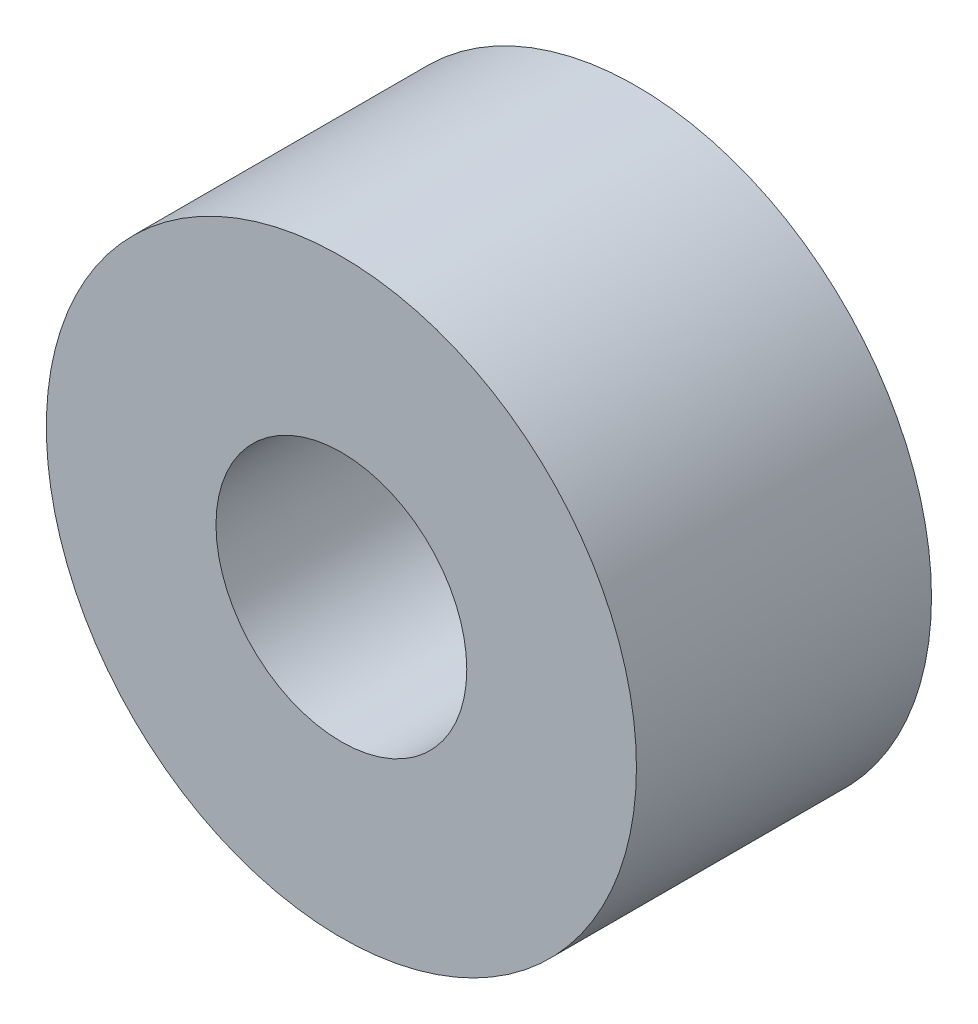
ISO-10303-21;
HEADER;
FILE_DESCRIPTION(('STEP AP214'),'2;1');
FILE_NAME('part.step','',(''),(''),'','','');
FILE_SCHEMA(('AUTOMOTIVE_DESIGN { 1 0 10303 214 1 1 1 1 }'));
ENDSEC;
DATA;
#1=APPLICATION_CONTEXT('core data for automotive mechanical design processes');
#2=APPLICATION_PROTOCOL_DEFINITION('international standard','automotive_design',2000,#1);
#3=PRODUCT_CONTEXT('',#1,'mechanical');
#4=PRODUCT('Part','Part','',(#3));
#5=PRODUCT_RELATED_PRODUCT_CATEGORY('part','',(#4));
#6=PRODUCT_DEFINITION_FORMATION('','',#4);
#7=PRODUCT_DEFINITION_CONTEXT('part definition',#1,'design');
#8=PRODUCT_DEFINITION('design','',#6,#7);
#9=PRODUCT_DEFINITION_SHAPE('','',#8);
#10=(LENGTH_UNIT() NAMED_UNIT(*) SI_UNIT(.MILLI.,.METRE.));
#11=(NAMED_UNIT(*) PLANE_ANGLE_UNIT() SI_UNIT($,.RADIAN.));
#12=(NAMED_UNIT(*) SI_UNIT($,.STERADIAN.) SOLID_ANGLE_UNIT());
#13=UNCERTAINTY_MEASURE_WITH_UNIT(LENGTH_MEASURE(1.E-05),#10,'distance_accuracy_value','');
#14=(GEOMETRIC_REPRESENTATION_CONTEXT(3) GLOBAL_UNCERTAINTY_ASSIGNED_CONTEXT((#13)) GLOBAL_UNIT_ASSIGNED_CONTEXT((#10,
#11,#12)) REPRESENTATION_CONTEXT('',''));
#15=CARTESIAN_POINT('',(0.,0.,0.));
#16=DIRECTION('',(0.,0.,1.));
#17=DIRECTION('',(1.,0.,0.));
#18=AXIS2_PLACEMENT_3D('',#15,#16,#17);
#19=CARTESIAN_POINT('',(-19.5000000000001,52.7999999999997,4.));
#20=DIRECTION('',(0.,0.,1.));
#21=DIRECTION('',(1.,0.,0.));
#22=AXIS2_PLACEMENT_3D('',#19,#20,#21);
#23=PLANE('',#22);
#24=CARTESIAN_POINT('',(-19.5000000000001,52.7999999999997,4.));
#25=DIRECTION('',(0.,0.,1.));
#26=DIRECTION('',(1.,0.,0.));
#27=AXIS2_PLACEMENT_3D('',#24,#25,#26);
#28=CIRCLE('',#27,4.);
#29=CARTESIAN_POINT('',(-15.5000000000001,52.7999999999997,4.));
#30=VERTEX_POINT('',#29);
#31=EDGE_CURVE('E10',#30,#30,#28,.T.);
#32=ORIENTED_EDGE('',*,*,#31,.T.);
#33=EDGE_LOOP('',(#32));
#34=FACE_BOUND('',#33,.T.);
#35=CARTESIAN_POINT('',(-19.5000000000001,52.7999999999997,4.));
#36=DIRECTION('',(0.,0.,1.));
#37=DIRECTION('',(1.,0.,0.));
#38=AXIS2_PLACEMENT_3D('',#35,#36,#37);
#39=CIRCLE('',#38,1.7);
#40=CARTESIAN_POINT('',(-17.8000000000001,52.7999999999997,4.));
#41=VERTEX_POINT('',#40);
#42=EDGE_CURVE('E43',#41,#41,#39,.T.);
#43=ORIENTED_EDGE('',*,*,#42,.F.);
#44=EDGE_LOOP('',(#43));
#45=FACE_BOUND('',#44,.T.);
#46=ADVANCED_FACE('F32',(#34,#45),#23,.T.);
#47=CARTESIAN_POINT('',(-19.5000000000001,52.7999999999997,0.));
#48=DIRECTION('',(0.,0.,1.));
#49=DIRECTION('',(1.,0.,0.));
#50=AXIS2_PLACEMENT_3D('',#47,#48,#49);
#51=PLANE('',#50);
#52=CARTESIAN_POINT('',(-19.5000000000001,52.7999999999997,0.));
#53=DIRECTION('',(0.,0.,1.));
#54=DIRECTION('',(1.,0.,0.));
#55=AXIS2_PLACEMENT_3D('',#52,#53,#54);
#56=CIRCLE('',#55,4.);
#57=CARTESIAN_POINT('',(-15.5000000000001,52.7999999999997,0.));
#58=VERTEX_POINT('',#57);
#59=EDGE_CURVE('E36',#58,#58,#56,.T.);
#60=ORIENTED_EDGE('',*,*,#59,.F.);
#61=EDGE_LOOP('',(#60));
#62=FACE_BOUND('',#61,.T.);
#63=CARTESIAN_POINT('',(-19.5000000000001,52.7999999999997,0.));
#64=DIRECTION('',(0.,0.,1.));
#65=DIRECTION('',(1.,0.,0.));
#66=AXIS2_PLACEMENT_3D('',#63,#64,#65);
#67=CIRCLE('',#66,1.7);
#68=CARTESIAN_POINT('',(-17.8000000000001,52.7999999999997,0.));
#69=VERTEX_POINT('',#68);
#70=EDGE_CURVE('E45',#69,#69,#67,.T.);
#71=ORIENTED_EDGE('',*,*,#70,.T.);
#72=EDGE_LOOP('',(#71));
#73=FACE_BOUND('',#72,.T.);
#74=ADVANCED_FACE('F55',(#62,#73),#51,.F.);
#75=CARTESIAN_POINT('',(-19.5000000000001,52.7999999999997,4.));
#76=DIRECTION('',(0.,0.,-1.));
#77=DIRECTION('',(-1.,0.,0.));
#78=AXIS2_PLACEMENT_3D('',#75,#76,#77);
#79=CYLINDRICAL_SURFACE('',#78,4.);
#80=ORIENTED_EDGE('',*,*,#31,.F.);
#81=EDGE_LOOP('',(#80));
#82=FACE_BOUND('',#81,.T.);
#83=ORIENTED_EDGE('',*,*,#59,.T.);
#84=EDGE_LOOP('',(#83));
#85=FACE_BOUND('',#84,.T.);
#86=ADVANCED_FACE('F34',(#82,#85),#79,.T.);
#87=CARTESIAN_POINT('',(-19.5000000000001,52.7999999999997,4.));
#88=DIRECTION('',(0.,0.,-1.));
#89=DIRECTION('',(-1.,0.,0.));
#90=AXIS2_PLACEMENT_3D('',#87,#88,#89);
#91=CYLINDRICAL_SURFACE('',#90,1.7);
#92=ORIENTED_EDGE('',*,*,#42,.T.);
#93=EDGE_LOOP('',(#92));
#94=FACE_BOUND('',#93,.T.);
#95=ORIENTED_EDGE('',*,*,#70,.F.);
#96=EDGE_LOOP('',(#95));
#97=FACE_BOUND('',#96,.T.);
#98=ADVANCED_FACE('F51',(#94,#97),#91,.F.);
#99=CLOSED_SHELL('',(#46,#74,#86,#98));
#100=MANIFOLD_SOLID_BREP('B2',#99);
#101=ADVANCED_BREP_SHAPE_REPRESENTATION('',(#18,#100),#14);
#102=SHAPE_DEFINITION_REPRESENTATION(#9,#101);
ENDSEC;
END-ISO-10303-21;
